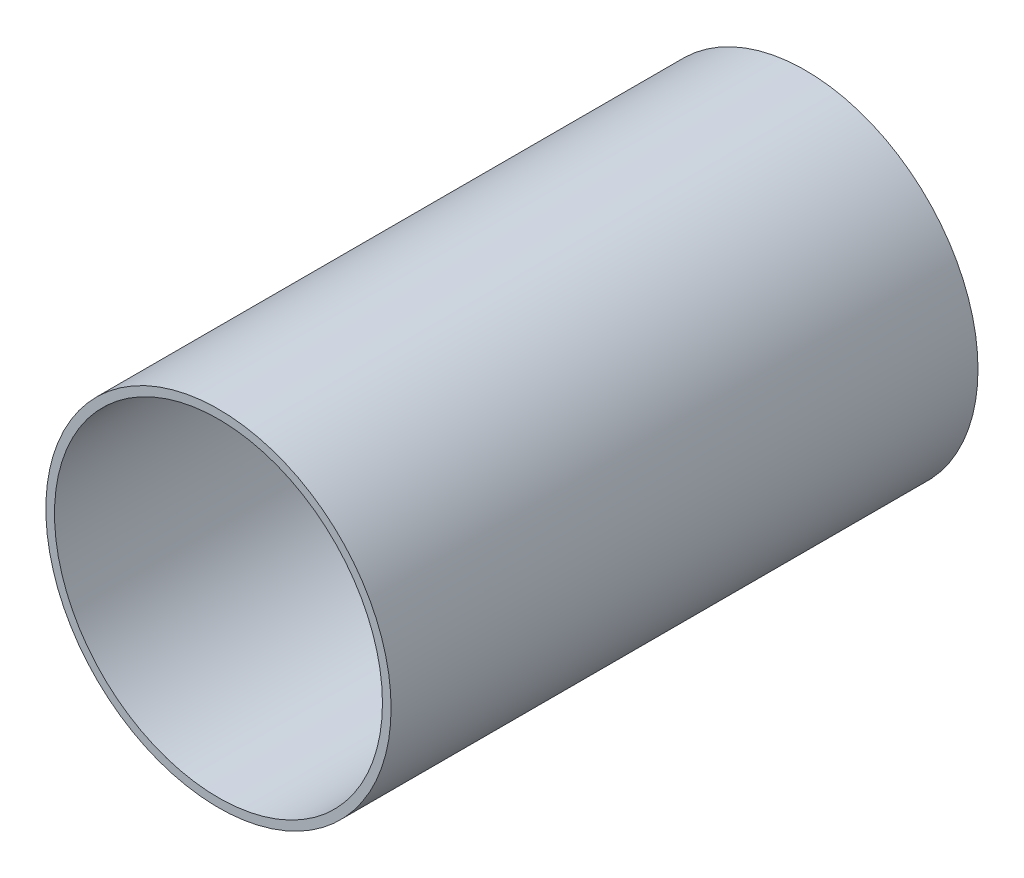
ISO-10303-21;
HEADER;
FILE_DESCRIPTION(('STEP AP214'),'2;1');
FILE_NAME('part.step','',(''),(''),'','','');
FILE_SCHEMA(('AUTOMOTIVE_DESIGN { 1 0 10303 214 1 1 1 1 }'));
ENDSEC;
DATA;
#1=APPLICATION_CONTEXT('core data for automotive mechanical design processes');
#2=APPLICATION_PROTOCOL_DEFINITION('international standard','automotive_design',2000,#1);
#3=PRODUCT_CONTEXT('',#1,'mechanical');
#4=PRODUCT('Part','Part','',(#3));
#5=PRODUCT_RELATED_PRODUCT_CATEGORY('part','',(#4));
#6=PRODUCT_DEFINITION_FORMATION('','',#4);
#7=PRODUCT_DEFINITION_CONTEXT('part definition',#1,'design');
#8=PRODUCT_DEFINITION('design','',#6,#7);
#9=PRODUCT_DEFINITION_SHAPE('','',#8);
#10=(LENGTH_UNIT() NAMED_UNIT(*) SI_UNIT(.MILLI.,.METRE.));
#11=(NAMED_UNIT(*) PLANE_ANGLE_UNIT() SI_UNIT($,.RADIAN.));
#12=(NAMED_UNIT(*) SI_UNIT($,.STERADIAN.) SOLID_ANGLE_UNIT());
#13=UNCERTAINTY_MEASURE_WITH_UNIT(LENGTH_MEASURE(1.E-05),#10,'distance_accuracy_value','');
#14=(GEOMETRIC_REPRESENTATION_CONTEXT(3) GLOBAL_UNCERTAINTY_ASSIGNED_CONTEXT((#13)) GLOBAL_UNIT_ASSIGNED_CONTEXT((#10,
#11,#12)) REPRESENTATION_CONTEXT('',''));
#15=CARTESIAN_POINT('',(0.,0.,0.));
#16=DIRECTION('',(0.,0.,1.));
#17=DIRECTION('',(1.,0.,0.));
#18=AXIS2_PLACEMENT_3D('',#15,#16,#17);
#19=CARTESIAN_POINT('',(0.,0.,107.95));
#20=DIRECTION('',(0.,0.,1.));
#21=DIRECTION('',(1.,0.,0.));
#22=AXIS2_PLACEMENT_3D('',#19,#20,#21);
#23=PLANE('',#22);
#24=CARTESIAN_POINT('',(0.,0.,107.95));
#25=DIRECTION('',(0.,0.,1.));
#26=DIRECTION('',(1.,0.,0.));
#27=AXIS2_PLACEMENT_3D('',#24,#25,#26);
#28=CIRCLE('',#27,63.5);
#29=CARTESIAN_POINT('',(63.5,0.,107.95));
#30=VERTEX_POINT('',#29);
#31=EDGE_CURVE('E10',#30,#30,#28,.T.);
#32=ORIENTED_EDGE('',*,*,#31,.T.);
#33=EDGE_LOOP('',(#32));
#34=FACE_BOUND('',#33,.T.);
#35=CARTESIAN_POINT('',(0.,0.,107.95));
#36=DIRECTION('',(0.,0.,1.));
#37=DIRECTION('',(1.,0.,0.));
#38=AXIS2_PLACEMENT_3D('',#35,#36,#37);
#39=CIRCLE('',#38,60.325);
#40=CARTESIAN_POINT('',(60.325,0.,107.95));
#41=VERTEX_POINT('',#40);
#42=EDGE_CURVE('E48',#41,#41,#39,.T.);
#43=ORIENTED_EDGE('',*,*,#42,.F.);
#44=EDGE_LOOP('',(#43));
#45=FACE_BOUND('',#44,.T.);
#46=ADVANCED_FACE('F37',(#34,#45),#23,.T.);
#47=CARTESIAN_POINT('',(0.,0.,-107.95));
#48=DIRECTION('',(0.,0.,1.));
#49=DIRECTION('',(1.,0.,0.));
#50=AXIS2_PLACEMENT_3D('',#47,#48,#49);
#51=PLANE('',#50);
#52=CARTESIAN_POINT('',(0.,0.,-107.95));
#53=DIRECTION('',(0.,0.,1.));
#54=DIRECTION('',(1.,0.,0.));
#55=AXIS2_PLACEMENT_3D('',#52,#53,#54);
#56=CIRCLE('',#55,63.5);
#57=CARTESIAN_POINT('',(63.5,0.,-107.95));
#58=VERTEX_POINT('',#57);
#59=EDGE_CURVE('E41',#58,#58,#56,.T.);
#60=ORIENTED_EDGE('',*,*,#59,.F.);
#61=EDGE_LOOP('',(#60));
#62=FACE_BOUND('',#61,.T.);
#63=CARTESIAN_POINT('',(0.,0.,-107.95));
#64=DIRECTION('',(0.,0.,1.));
#65=DIRECTION('',(1.,0.,0.));
#66=AXIS2_PLACEMENT_3D('',#63,#64,#65);
#67=CIRCLE('',#66,60.325);
#68=CARTESIAN_POINT('',(60.325,0.,-107.95));
#69=VERTEX_POINT('',#68);
#70=EDGE_CURVE('E50',#69,#69,#67,.T.);
#71=ORIENTED_EDGE('',*,*,#70,.T.);
#72=EDGE_LOOP('',(#71));
#73=FACE_BOUND('',#72,.T.);
#74=ADVANCED_FACE('F60',(#62,#73),#51,.F.);
#75=CARTESIAN_POINT('',(0.,0.,107.95));
#76=DIRECTION('',(0.,0.,-1.));
#77=DIRECTION('',(-1.,0.,0.));
#78=AXIS2_PLACEMENT_3D('',#75,#76,#77);
#79=CYLINDRICAL_SURFACE('',#78,63.5);
#80=ORIENTED_EDGE('',*,*,#31,.F.);
#81=EDGE_LOOP('',(#80));
#82=FACE_BOUND('',#81,.T.);
#83=ORIENTED_EDGE('',*,*,#59,.T.);
#84=EDGE_LOOP('',(#83));
#85=FACE_BOUND('',#84,.T.);
#86=ADVANCED_FACE('F39',(#82,#85),#79,.T.);
#87=CARTESIAN_POINT('',(0.,0.,107.95));
#88=DIRECTION('',(0.,0.,-1.));
#89=DIRECTION('',(-1.,0.,0.));
#90=AXIS2_PLACEMENT_3D('',#87,#88,#89);
#91=CYLINDRICAL_SURFACE('',#90,60.325);
#92=ORIENTED_EDGE('',*,*,#42,.T.);
#93=EDGE_LOOP('',(#92));
#94=FACE_BOUND('',#93,.T.);
#95=ORIENTED_EDGE('',*,*,#70,.F.);
#96=EDGE_LOOP('',(#95));
#97=FACE_BOUND('',#96,.T.);
#98=ADVANCED_FACE('F56',(#94,#97),#91,.F.);
#99=CLOSED_SHELL('',(#46,#74,#86,#98));
#100=MANIFOLD_SOLID_BREP('B2',#99);
#101=ADVANCED_BREP_SHAPE_REPRESENTATION('',(#18,#100),#14);
#102=SHAPE_DEFINITION_REPRESENTATION(#9,#101);
ENDSEC;
END-ISO-10303-21;
